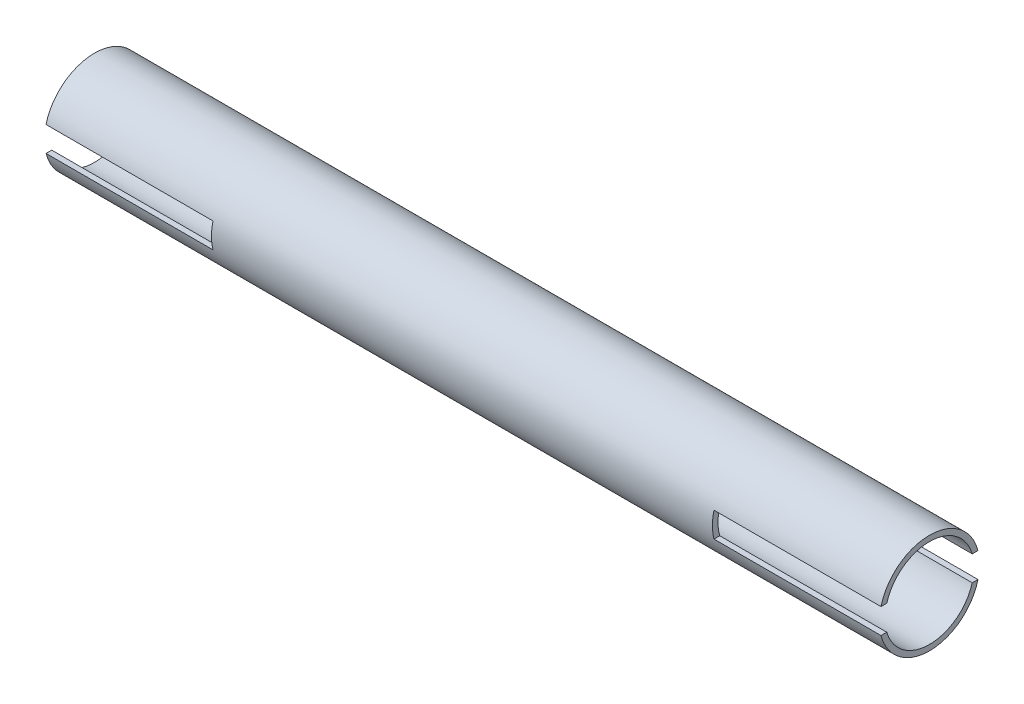
ISO-10303-21;
HEADER;
FILE_DESCRIPTION(('STEP AP214'),'2;1');
FILE_NAME('part.step','',(''),(''),'','','');
FILE_SCHEMA(('AUTOMOTIVE_DESIGN { 1 0 10303 214 1 1 1 1 }'));
ENDSEC;
DATA;
#1=APPLICATION_CONTEXT('core data for automotive mechanical design processes');
#2=APPLICATION_PROTOCOL_DEFINITION('international standard','automotive_design',2000,#1);
#3=PRODUCT_CONTEXT('',#1,'mechanical');
#4=PRODUCT('Part','Part','',(#3));
#5=PRODUCT_RELATED_PRODUCT_CATEGORY('part','',(#4));
#6=PRODUCT_DEFINITION_FORMATION('','',#4);
#7=PRODUCT_DEFINITION_CONTEXT('part definition',#1,'design');
#8=PRODUCT_DEFINITION('design','',#6,#7);
#9=PRODUCT_DEFINITION_SHAPE('','',#8);
#10=(LENGTH_UNIT() NAMED_UNIT(*) SI_UNIT(.MILLI.,.METRE.));
#11=(NAMED_UNIT(*) PLANE_ANGLE_UNIT() SI_UNIT($,.RADIAN.));
#12=(NAMED_UNIT(*) SI_UNIT($,.STERADIAN.) SOLID_ANGLE_UNIT());
#13=UNCERTAINTY_MEASURE_WITH_UNIT(LENGTH_MEASURE(1.E-05),#10,'distance_accuracy_value','');
#14=(GEOMETRIC_REPRESENTATION_CONTEXT(3) GLOBAL_UNCERTAINTY_ASSIGNED_CONTEXT((#13)) GLOBAL_UNIT_ASSIGNED_CONTEXT((#10,
#11,#12)) REPRESENTATION_CONTEXT('',''));
#15=CARTESIAN_POINT('',(0.,0.,0.));
#16=DIRECTION('',(0.,0.,1.));
#17=DIRECTION('',(1.,0.,0.));
#18=AXIS2_PLACEMENT_3D('',#15,#16,#17);
#19=CARTESIAN_POINT('',(158.75,4.7625,165.2397));
#20=DIRECTION('',(0.,1.,0.));
#21=DIRECTION('',(0.,0.,1.));
#22=AXIS2_PLACEMENT_3D('',#19,#20,#21);
#23=PLANE('',#22);
#24=DIRECTION('',(0.,0.,1.));
#25=VECTOR('',#24,1.);
#26=CARTESIAN_POINT('',(95.25,4.7625,165.2397));
#27=LINE('',#26,#25);
#28=CARTESIAN_POINT('',(95.25,4.76249999999989,-16.2586340444086));
#29=VERTEX_POINT('',#28);
#30=CARTESIAN_POINT('',(95.25,4.76249999999997,-18.4450831863128));
#31=VERTEX_POINT('',#30);
#32=EDGE_CURVE('E135',#29,#31,#27,.F.);
#33=ORIENTED_EDGE('',*,*,#32,.T.);
#34=DIRECTION('',(1.,0.,0.));
#35=VECTOR('',#34,1.);
#36=CARTESIAN_POINT('',(-158.75,4.76249999999994,-18.4450831863128));
#37=LINE('',#36,#35);
#38=CARTESIAN_POINT('',(158.75,4.76249999999997,-18.4450831863128));
#39=VERTEX_POINT('',#38);
#40=EDGE_CURVE('E194',#39,#31,#37,.F.);
#41=ORIENTED_EDGE('',*,*,#40,.F.);
#42=DIRECTION('',(0.,0.,-1.));
#43=VECTOR('',#42,1.);
#44=CARTESIAN_POINT('',(158.75,4.7625,0.));
#45=LINE('',#44,#43);
#46=CARTESIAN_POINT('',(158.75,4.76249999999989,-16.2586340444086));
#47=VERTEX_POINT('',#46);
#48=EDGE_CURVE('E198',#47,#39,#45,.T.);
#49=ORIENTED_EDGE('',*,*,#48,.F.);
#50=DIRECTION('',(1.,0.,0.));
#51=VECTOR('',#50,1.);
#52=CARTESIAN_POINT('',(-158.75,4.76249999999979,-16.2586340444086));
#53=LINE('',#52,#51);
#54=EDGE_CURVE('E125',#47,#29,#53,.F.);
#55=ORIENTED_EDGE('',*,*,#54,.T.);
#56=EDGE_LOOP('',(#33,#41,#49,#55));
#57=FACE_BOUND('',#56,.T.);
#58=ADVANCED_FACE('F17',(#57),#23,.F.);
#59=CARTESIAN_POINT('',(95.25,4.7625,165.2397));
#60=DIRECTION('',(-1.,0.,0.));
#61=DIRECTION('',(0.,0.,1.));
#62=AXIS2_PLACEMENT_3D('',#59,#60,#61);
#63=PLANE('',#62);
#64=CARTESIAN_POINT('',(95.25,0.,0.));
#65=DIRECTION('',(1.,0.,0.));
#66=DIRECTION('',(0.,0.,-1.));
#67=AXIS2_PLACEMENT_3D('',#64,#65,#66);
#68=CIRCLE('',#67,16.9418);
#69=CARTESIAN_POINT('',(95.25,-4.76249999999989,-16.2586340444086));
#70=VERTEX_POINT('',#69);
#71=EDGE_CURVE('E20',#29,#70,#68,.F.);
#72=ORIENTED_EDGE('',*,*,#71,.T.);
#73=DIRECTION('',(0.,0.,-1.));
#74=VECTOR('',#73,1.);
#75=CARTESIAN_POINT('',(95.25,-4.7625,165.2397));
#76=LINE('',#75,#74);
#77=CARTESIAN_POINT('',(95.25,-4.76249999999997,-18.4450831863128));
#78=VERTEX_POINT('',#77);
#79=EDGE_CURVE('E133',#70,#78,#76,.T.);
#80=ORIENTED_EDGE('',*,*,#79,.T.);
#81=CARTESIAN_POINT('',(95.25,0.,0.));
#82=DIRECTION('',(1.,0.,0.));
#83=DIRECTION('',(0.,0.,-1.));
#84=AXIS2_PLACEMENT_3D('',#81,#82,#83);
#85=CIRCLE('',#84,19.05);
#86=EDGE_CURVE('E192',#31,#78,#85,.F.);
#87=ORIENTED_EDGE('',*,*,#86,.F.);
#88=ORIENTED_EDGE('',*,*,#32,.F.);
#89=EDGE_LOOP('',(#72,#80,#87,#88));
#90=FACE_BOUND('',#89,.T.);
#91=ADVANCED_FACE('F131',(#90),#63,.F.);
#92=CARTESIAN_POINT('',(95.25,-4.7625,165.2397));
#93=DIRECTION('',(0.,-1.,0.));
#94=DIRECTION('',(0.,0.,-1.));
#95=AXIS2_PLACEMENT_3D('',#92,#93,#94);
#96=PLANE('',#95);
#97=ORIENTED_EDGE('',*,*,#79,.F.);
#98=DIRECTION('',(1.,0.,0.));
#99=VECTOR('',#98,1.);
#100=CARTESIAN_POINT('',(-158.75,-4.76249999999979,-16.2586340444086));
#101=LINE('',#100,#99);
#102=CARTESIAN_POINT('',(158.75,-4.76249999999989,-16.2586340444086));
#103=VERTEX_POINT('',#102);
#104=EDGE_CURVE('E138',#70,#103,#101,.T.);
#105=ORIENTED_EDGE('',*,*,#104,.T.);
#106=DIRECTION('',(0.,0.,-1.));
#107=VECTOR('',#106,1.);
#108=CARTESIAN_POINT('',(158.75,-4.7625,0.));
#109=LINE('',#108,#107);
#110=CARTESIAN_POINT('',(158.75,-4.76249999999997,-18.4450831863128));
#111=VERTEX_POINT('',#110);
#112=EDGE_CURVE('E205',#111,#103,#109,.F.);
#113=ORIENTED_EDGE('',*,*,#112,.F.);
#114=DIRECTION('',(1.,0.,0.));
#115=VECTOR('',#114,1.);
#116=CARTESIAN_POINT('',(-158.75,-4.76249999999994,-18.4450831863128));
#117=LINE('',#116,#115);
#118=EDGE_CURVE('E145',#78,#111,#117,.T.);
#119=ORIENTED_EDGE('',*,*,#118,.F.);
#120=EDGE_LOOP('',(#97,#105,#113,#119));
#121=FACE_BOUND('',#120,.T.);
#122=ADVANCED_FACE('F141',(#121),#96,.F.);
#123=CARTESIAN_POINT('',(-95.25,-4.7625,165.2397));
#124=DIRECTION('',(0.,1.,0.));
#125=DIRECTION('',(0.,0.,1.));
#126=AXIS2_PLACEMENT_3D('',#123,#124,#125);
#127=PLANE('',#126);
#128=DIRECTION('',(1.,0.,0.));
#129=VECTOR('',#128,1.);
#130=CARTESIAN_POINT('',(-158.75,-4.76249999999979,-16.2586340444086));
#131=LINE('',#130,#129);
#132=CARTESIAN_POINT('',(-158.75,-4.76249999999989,-16.2586340444086));
#133=VERTEX_POINT('',#132);
#134=CARTESIAN_POINT('',(-95.25,-4.76249999999989,-16.2586340444086));
#135=VERTEX_POINT('',#134);
#136=EDGE_CURVE('E153',#133,#135,#131,.T.);
#137=ORIENTED_EDGE('',*,*,#136,.T.);
#138=DIRECTION('',(0.,0.,1.));
#139=VECTOR('',#138,1.);
#140=CARTESIAN_POINT('',(-95.25,-4.7625,165.2397));
#141=LINE('',#140,#139);
#142=CARTESIAN_POINT('',(-95.25,-4.76249999999997,-18.4450831863128));
#143=VERTEX_POINT('',#142);
#144=EDGE_CURVE('E147',#143,#135,#141,.T.);
#145=ORIENTED_EDGE('',*,*,#144,.F.);
#146=DIRECTION('',(1.,0.,0.));
#147=VECTOR('',#146,1.);
#148=CARTESIAN_POINT('',(-158.75,-4.76249999999994,-18.4450831863128));
#149=LINE('',#148,#147);
#150=CARTESIAN_POINT('',(-158.75,-4.76249999999997,-18.4450831863128));
#151=VERTEX_POINT('',#150);
#152=EDGE_CURVE('E191',#151,#143,#149,.T.);
#153=ORIENTED_EDGE('',*,*,#152,.F.);
#154=DIRECTION('',(0.,0.,-1.));
#155=VECTOR('',#154,1.);
#156=CARTESIAN_POINT('',(-158.75,-4.7625,0.));
#157=LINE('',#156,#155);
#158=EDGE_CURVE('E209',#151,#133,#157,.F.);
#159=ORIENTED_EDGE('',*,*,#158,.T.);
#160=EDGE_LOOP('',(#137,#145,#153,#159));
#161=FACE_BOUND('',#160,.T.);
#162=ADVANCED_FACE('F410',(#161),#127,.T.);
#163=CARTESIAN_POINT('',(-95.25,4.7625,165.2397));
#164=DIRECTION('',(-1.,0.,0.));
#165=DIRECTION('',(0.,0.,1.));
#166=AXIS2_PLACEMENT_3D('',#163,#164,#165);
#167=PLANE('',#166);
#168=CARTESIAN_POINT('',(-95.25,0.,0.));
#169=DIRECTION('',(1.,0.,0.));
#170=DIRECTION('',(0.,0.,-1.));
#171=AXIS2_PLACEMENT_3D('',#168,#169,#170);
#172=CIRCLE('',#171,16.9418);
#173=CARTESIAN_POINT('',(-95.25,4.7625,-16.2586340444089));
#174=VERTEX_POINT('',#173);
#175=EDGE_CURVE('E155',#135,#174,#172,.T.);
#176=ORIENTED_EDGE('',*,*,#175,.T.);
#177=DIRECTION('',(0.,0.,-1.));
#178=VECTOR('',#177,1.);
#179=CARTESIAN_POINT('',(-95.25,4.7625,165.2397));
#180=LINE('',#179,#178);
#181=CARTESIAN_POINT('',(-95.25,4.76249999999997,-18.4450831863128));
#182=VERTEX_POINT('',#181);
#183=EDGE_CURVE('E211',#182,#174,#180,.F.);
#184=ORIENTED_EDGE('',*,*,#183,.F.);
#185=CARTESIAN_POINT('',(-95.25,0.,0.));
#186=DIRECTION('',(1.,0.,0.));
#187=DIRECTION('',(0.,0.,-1.));
#188=AXIS2_PLACEMENT_3D('',#185,#186,#187);
#189=CIRCLE('',#188,19.05);
#190=EDGE_CURVE('E188',#143,#182,#189,.T.);
#191=ORIENTED_EDGE('',*,*,#190,.F.);
#192=ORIENTED_EDGE('',*,*,#144,.T.);
#193=EDGE_LOOP('',(#176,#184,#191,#192));
#194=FACE_BOUND('',#193,.T.);
#195=ADVANCED_FACE('F402',(#194),#167,.T.);
#196=CARTESIAN_POINT('',(-158.75,4.7625,165.2397));
#197=DIRECTION('',(0.,-1.,0.));
#198=DIRECTION('',(0.,0.,-1.));
#199=AXIS2_PLACEMENT_3D('',#196,#197,#198);
#200=PLANE('',#199);
#201=DIRECTION('',(1.,0.,0.));
#202=VECTOR('',#201,1.);
#203=CARTESIAN_POINT('',(-158.75,4.76249999999994,-18.4450831863128));
#204=LINE('',#203,#202);
#205=CARTESIAN_POINT('',(-158.75,4.76249999999997,-18.4450831863128));
#206=VERTEX_POINT('',#205);
#207=EDGE_CURVE('E187',#182,#206,#204,.F.);
#208=ORIENTED_EDGE('',*,*,#207,.F.);
#209=ORIENTED_EDGE('',*,*,#183,.T.);
#210=DIRECTION('',(1.,0.,0.));
#211=VECTOR('',#210,1.);
#212=CARTESIAN_POINT('',(-158.75,4.7625,-16.2586340444093));
#213=LINE('',#212,#211);
#214=CARTESIAN_POINT('',(-158.75,4.7625,-16.2586340444089));
#215=VERTEX_POINT('',#214);
#216=EDGE_CURVE('E212',#174,#215,#213,.F.);
#217=ORIENTED_EDGE('',*,*,#216,.T.);
#218=DIRECTION('',(0.,0.,-1.));
#219=VECTOR('',#218,1.);
#220=CARTESIAN_POINT('',(-158.75,4.7625,0.));
#221=LINE('',#220,#219);
#222=EDGE_CURVE('E186',#215,#206,#221,.T.);
#223=ORIENTED_EDGE('',*,*,#222,.T.);
#224=EDGE_LOOP('',(#208,#209,#217,#223));
#225=FACE_BOUND('',#224,.T.);
#226=ADVANCED_FACE('F394',(#225),#200,.T.);
#227=CARTESIAN_POINT('',(-158.75,0.,0.));
#228=DIRECTION('',(1.,0.,0.));
#229=DIRECTION('',(0.,0.,-1.));
#230=AXIS2_PLACEMENT_3D('',#227,#228,#229);
#231=CYLINDRICAL_SURFACE('',#230,16.9418);
#232=CARTESIAN_POINT('',(158.75,0.,0.));
#233=DIRECTION('',(1.,0.,0.));
#234=DIRECTION('',(0.,0.,-1.));
#235=AXIS2_PLACEMENT_3D('',#232,#233,#234);
#236=CIRCLE('',#235,16.9418);
#237=CARTESIAN_POINT('',(158.75,-4.7625,16.2586340444089));
#238=VERTEX_POINT('',#237);
#239=EDGE_CURVE('E152',#103,#238,#236,.F.);
#240=ORIENTED_EDGE('',*,*,#239,.F.);
#241=ORIENTED_EDGE('',*,*,#104,.F.);
#242=ORIENTED_EDGE('',*,*,#71,.F.);
#243=ORIENTED_EDGE('',*,*,#54,.F.);
#244=CARTESIAN_POINT('',(158.75,0.,0.));
#245=DIRECTION('',(1.,0.,0.));
#246=DIRECTION('',(0.,0.,-1.));
#247=AXIS2_PLACEMENT_3D('',#244,#245,#246);
#248=CIRCLE('',#247,16.9418);
#249=CARTESIAN_POINT('',(158.75,4.7625,16.2586340444089));
#250=VERTEX_POINT('',#249);
#251=EDGE_CURVE('E195',#250,#47,#248,.F.);
#252=ORIENTED_EDGE('',*,*,#251,.F.);
#253=DIRECTION('',(1.,0.,0.));
#254=VECTOR('',#253,1.);
#255=CARTESIAN_POINT('',(158.75,4.7625,16.2586340444093));
#256=LINE('',#255,#254);
#257=CARTESIAN_POINT('',(95.25,4.7625,16.2586340444089));
#258=VERTEX_POINT('',#257);
#259=EDGE_CURVE('E235',#250,#258,#256,.F.);
#260=ORIENTED_EDGE('',*,*,#259,.T.);
#261=CARTESIAN_POINT('',(95.25,0.,0.));
#262=DIRECTION('',(1.,0.,0.));
#263=DIRECTION('',(0.,0.,-1.));
#264=AXIS2_PLACEMENT_3D('',#261,#262,#263);
#265=CIRCLE('',#264,16.9418);
#266=CARTESIAN_POINT('',(95.25,-4.7625,16.2586340444089));
#267=VERTEX_POINT('',#266);
#268=EDGE_CURVE('E200',#258,#267,#265,.T.);
#269=ORIENTED_EDGE('',*,*,#268,.T.);
#270=DIRECTION('',(1.,0.,0.));
#271=VECTOR('',#270,1.);
#272=CARTESIAN_POINT('',(95.25,-4.7625,16.2586340444093));
#273=LINE('',#272,#271);
#274=EDGE_CURVE('E158',#267,#238,#273,.T.);
#275=ORIENTED_EDGE('',*,*,#274,.T.);
#276=EDGE_LOOP('',(#240,#241,#242,#243,#252,#260,#269,#275));
#277=FACE_BOUND('',#276,.T.);
#278=DIRECTION('',(1.,0.,0.));
#279=VECTOR('',#278,1.);
#280=CARTESIAN_POINT('',(-158.75,4.7625,16.2586340444093));
#281=LINE('',#280,#279);
#282=CARTESIAN_POINT('',(-158.75,4.7625,16.2586340444089));
#283=VERTEX_POINT('',#282);
#284=CARTESIAN_POINT('',(-95.25,4.7625,16.2586340444089));
#285=VERTEX_POINT('',#284);
#286=EDGE_CURVE('E260',#283,#285,#281,.T.);
#287=ORIENTED_EDGE('',*,*,#286,.F.);
#288=CARTESIAN_POINT('',(-158.75,0.,0.));
#289=DIRECTION('',(1.,0.,0.));
#290=DIRECTION('',(0.,0.,-1.));
#291=AXIS2_PLACEMENT_3D('',#288,#289,#290);
#292=CIRCLE('',#291,16.9418);
#293=EDGE_CURVE('E184',#283,#215,#292,.F.);
#294=ORIENTED_EDGE('',*,*,#293,.T.);
#295=ORIENTED_EDGE('',*,*,#216,.F.);
#296=ORIENTED_EDGE('',*,*,#175,.F.);
#297=ORIENTED_EDGE('',*,*,#136,.F.);
#298=CARTESIAN_POINT('',(-158.75,0.,0.));
#299=DIRECTION('',(1.,0.,0.));
#300=DIRECTION('',(0.,0.,-1.));
#301=AXIS2_PLACEMENT_3D('',#298,#299,#300);
#302=CIRCLE('',#301,16.9418);
#303=CARTESIAN_POINT('',(-158.75,-4.7625,16.2586340444089));
#304=VERTEX_POINT('',#303);
#305=EDGE_CURVE('E206',#133,#304,#302,.F.);
#306=ORIENTED_EDGE('',*,*,#305,.T.);
#307=DIRECTION('',(1.,0.,0.));
#308=VECTOR('',#307,1.);
#309=CARTESIAN_POINT('',(-95.25,-4.7625,16.2586340444093));
#310=LINE('',#309,#308);
#311=CARTESIAN_POINT('',(-95.25,-4.7625,16.2586340444089));
#312=VERTEX_POINT('',#311);
#313=EDGE_CURVE('E161',#312,#304,#310,.F.);
#314=ORIENTED_EDGE('',*,*,#313,.F.);
#315=CARTESIAN_POINT('',(-95.25,0.,0.));
#316=DIRECTION('',(1.,0.,0.));
#317=DIRECTION('',(0.,0.,-1.));
#318=AXIS2_PLACEMENT_3D('',#315,#316,#317);
#319=CIRCLE('',#318,16.9418);
#320=EDGE_CURVE('E164',#285,#312,#319,.T.);
#321=ORIENTED_EDGE('',*,*,#320,.F.);
#322=EDGE_LOOP('',(#287,#294,#295,#296,#297,#306,#314,#321));
#323=FACE_BOUND('',#322,.T.);
#324=ADVANCED_FACE('F149',(#277,#323),#231,.F.);
#325=CARTESIAN_POINT('',(-95.25,4.7625,165.2397));
#326=DIRECTION('',(-1.,0.,0.));
#327=DIRECTION('',(0.,0.,1.));
#328=AXIS2_PLACEMENT_3D('',#325,#326,#327);
#329=PLANE('',#328);
#330=CARTESIAN_POINT('',(-95.25,0.,0.));
#331=DIRECTION('',(1.,0.,0.));
#332=DIRECTION('',(0.,0.,-1.));
#333=AXIS2_PLACEMENT_3D('',#330,#331,#332);
#334=CIRCLE('',#333,19.05);
#335=CARTESIAN_POINT('',(-95.25,4.76249999999997,18.4450831863128));
#336=VERTEX_POINT('',#335);
#337=CARTESIAN_POINT('',(-95.25,-4.76249999999997,18.4450831863128));
#338=VERTEX_POINT('',#337);
#339=EDGE_CURVE('E180',#336,#338,#334,.T.);
#340=ORIENTED_EDGE('',*,*,#339,.F.);
#341=DIRECTION('',(0.,0.,-1.));
#342=VECTOR('',#341,1.);
#343=CARTESIAN_POINT('',(-95.25,4.7625,165.2397));
#344=LINE('',#343,#342);
#345=EDGE_CURVE('E183',#285,#336,#344,.F.);
#346=ORIENTED_EDGE('',*,*,#345,.F.);
#347=ORIENTED_EDGE('',*,*,#320,.T.);
#348=DIRECTION('',(0.,0.,1.));
#349=VECTOR('',#348,1.);
#350=CARTESIAN_POINT('',(-95.25,-4.7625,165.2397));
#351=LINE('',#350,#349);
#352=EDGE_CURVE('E163',#338,#312,#351,.F.);
#353=ORIENTED_EDGE('',*,*,#352,.F.);
#354=EDGE_LOOP('',(#340,#346,#347,#353));
#355=FACE_BOUND('',#354,.T.);
#356=ADVANCED_FACE('F377',(#355),#329,.T.);
#357=CARTESIAN_POINT('',(-95.25,-4.7625,165.2397));
#358=DIRECTION('',(0.,1.,0.));
#359=DIRECTION('',(0.,0.,1.));
#360=AXIS2_PLACEMENT_3D('',#357,#358,#359);
#361=PLANE('',#360);
#362=DIRECTION('',(1.,0.,0.));
#363=VECTOR('',#362,1.);
#364=CARTESIAN_POINT('',(-158.75,-4.76249999999993,18.4450831863128));
#365=LINE('',#364,#363);
#366=CARTESIAN_POINT('',(-158.75,-4.76249999999997,18.4450831863128));
#367=VERTEX_POINT('',#366);
#368=EDGE_CURVE('E179',#338,#367,#365,.F.);
#369=ORIENTED_EDGE('',*,*,#368,.F.);
#370=ORIENTED_EDGE('',*,*,#352,.T.);
#371=ORIENTED_EDGE('',*,*,#313,.T.);
#372=DIRECTION('',(0.,0.,-1.));
#373=VECTOR('',#372,1.);
#374=CARTESIAN_POINT('',(-158.75,-4.7625,0.));
#375=LINE('',#374,#373);
#376=EDGE_CURVE('E253',#304,#367,#375,.F.);
#377=ORIENTED_EDGE('',*,*,#376,.T.);
#378=EDGE_LOOP('',(#369,#370,#371,#377));
#379=FACE_BOUND('',#378,.T.);
#380=ADVANCED_FACE('F368',(#379),#361,.T.);
#381=CARTESIAN_POINT('',(-158.75,0.,0.));
#382=DIRECTION('',(1.,0.,0.));
#383=DIRECTION('',(0.,0.,-1.));
#384=AXIS2_PLACEMENT_3D('',#381,#382,#383);
#385=PLANE('',#384);
#386=ORIENTED_EDGE('',*,*,#305,.F.);
#387=ORIENTED_EDGE('',*,*,#158,.F.);
#388=CARTESIAN_POINT('',(-158.75,0.,0.));
#389=DIRECTION('',(1.,0.,0.));
#390=DIRECTION('',(0.,0.,-1.));
#391=AXIS2_PLACEMENT_3D('',#388,#389,#390);
#392=CIRCLE('',#391,19.05);
#393=EDGE_CURVE('E177',#367,#151,#392,.T.);
#394=ORIENTED_EDGE('',*,*,#393,.F.);
#395=ORIENTED_EDGE('',*,*,#376,.F.);
#396=EDGE_LOOP('',(#386,#387,#394,#395));
#397=FACE_BOUND('',#396,.T.);
#398=ADVANCED_FACE('F296',(#397),#385,.F.);
#399=CARTESIAN_POINT('',(158.75,0.,0.));
#400=DIRECTION('',(1.,0.,0.));
#401=DIRECTION('',(0.,0.,-1.));
#402=AXIS2_PLACEMENT_3D('',#399,#400,#401);
#403=PLANE('',#402);
#404=ORIENTED_EDGE('',*,*,#239,.T.);
#405=DIRECTION('',(0.,0.,-1.));
#406=VECTOR('',#405,1.);
#407=CARTESIAN_POINT('',(158.75,-4.7625,165.2397));
#408=LINE('',#407,#406);
#409=CARTESIAN_POINT('',(158.75,-4.76249999999997,18.4450831863128));
#410=VERTEX_POINT('',#409);
#411=EDGE_CURVE('E204',#238,#410,#408,.F.);
#412=ORIENTED_EDGE('',*,*,#411,.T.);
#413=CARTESIAN_POINT('',(158.75,0.,0.));
#414=DIRECTION('',(1.,0.,0.));
#415=DIRECTION('',(0.,0.,-1.));
#416=AXIS2_PLACEMENT_3D('',#413,#414,#415);
#417=CIRCLE('',#416,19.05);
#418=EDGE_CURVE('E174',#111,#410,#417,.F.);
#419=ORIENTED_EDGE('',*,*,#418,.F.);
#420=ORIENTED_EDGE('',*,*,#112,.T.);
#421=EDGE_LOOP('',(#404,#412,#419,#420));
#422=FACE_BOUND('',#421,.T.);
#423=ADVANCED_FACE('F283',(#422),#403,.T.);
#424=CARTESIAN_POINT('',(95.25,-4.7625,165.2397));
#425=DIRECTION('',(0.,-1.,0.));
#426=DIRECTION('',(0.,0.,-1.));
#427=AXIS2_PLACEMENT_3D('',#424,#425,#426);
#428=PLANE('',#427);
#429=DIRECTION('',(0.,0.,1.));
#430=VECTOR('',#429,1.);
#431=CARTESIAN_POINT('',(95.25,-4.7625,165.2397));
#432=LINE('',#431,#430);
#433=CARTESIAN_POINT('',(95.25,-4.76249999999997,18.4450831863128));
#434=VERTEX_POINT('',#433);
#435=EDGE_CURVE('E202',#267,#434,#432,.T.);
#436=ORIENTED_EDGE('',*,*,#435,.T.);
#437=DIRECTION('',(1.,0.,0.));
#438=VECTOR('',#437,1.);
#439=CARTESIAN_POINT('',(-158.75,-4.76249999999993,18.4450831863128));
#440=LINE('',#439,#438);
#441=EDGE_CURVE('E173',#410,#434,#440,.F.);
#442=ORIENTED_EDGE('',*,*,#441,.F.);
#443=ORIENTED_EDGE('',*,*,#411,.F.);
#444=ORIENTED_EDGE('',*,*,#274,.F.);
#445=EDGE_LOOP('',(#436,#442,#443,#444));
#446=FACE_BOUND('',#445,.T.);
#447=ADVANCED_FACE('F285',(#446),#428,.F.);
#448=CARTESIAN_POINT('',(95.25,4.7625,165.2397));
#449=DIRECTION('',(-1.,0.,0.));
#450=DIRECTION('',(0.,0.,1.));
#451=AXIS2_PLACEMENT_3D('',#448,#449,#450);
#452=PLANE('',#451);
#453=ORIENTED_EDGE('',*,*,#268,.F.);
#454=DIRECTION('',(0.,0.,1.));
#455=VECTOR('',#454,1.);
#456=CARTESIAN_POINT('',(95.25,4.7625,165.2397));
#457=LINE('',#456,#455);
#458=CARTESIAN_POINT('',(95.25,4.76249999999997,18.4450831863128));
#459=VERTEX_POINT('',#458);
#460=EDGE_CURVE('E199',#258,#459,#457,.T.);
#461=ORIENTED_EDGE('',*,*,#460,.T.);
#462=CARTESIAN_POINT('',(95.25,0.,0.));
#463=DIRECTION('',(1.,0.,0.));
#464=DIRECTION('',(0.,0.,-1.));
#465=AXIS2_PLACEMENT_3D('',#462,#463,#464);
#466=CIRCLE('',#465,19.05);
#467=EDGE_CURVE('E170',#434,#459,#466,.F.);
#468=ORIENTED_EDGE('',*,*,#467,.F.);
#469=ORIENTED_EDGE('',*,*,#435,.F.);
#470=EDGE_LOOP('',(#453,#461,#468,#469));
#471=FACE_BOUND('',#470,.T.);
#472=ADVANCED_FACE('F287',(#471),#452,.F.);
#473=CARTESIAN_POINT('',(158.75,4.7625,165.2397));
#474=DIRECTION('',(0.,1.,0.));
#475=DIRECTION('',(0.,0.,1.));
#476=AXIS2_PLACEMENT_3D('',#473,#474,#475);
#477=PLANE('',#476);
#478=ORIENTED_EDGE('',*,*,#460,.F.);
#479=ORIENTED_EDGE('',*,*,#259,.F.);
#480=DIRECTION('',(0.,0.,-1.));
#481=VECTOR('',#480,1.);
#482=CARTESIAN_POINT('',(158.75,4.7625,0.));
#483=LINE('',#482,#481);
#484=CARTESIAN_POINT('',(158.75,4.76249999999997,18.4450831863128));
#485=VERTEX_POINT('',#484);
#486=EDGE_CURVE('E234',#485,#250,#483,.T.);
#487=ORIENTED_EDGE('',*,*,#486,.F.);
#488=DIRECTION('',(1.,0.,0.));
#489=VECTOR('',#488,1.);
#490=CARTESIAN_POINT('',(-158.75,4.76249999999994,18.4450831863128));
#491=LINE('',#490,#489);
#492=EDGE_CURVE('E169',#459,#485,#491,.T.);
#493=ORIENTED_EDGE('',*,*,#492,.F.);
#494=EDGE_LOOP('',(#478,#479,#487,#493));
#495=FACE_BOUND('',#494,.T.);
#496=ADVANCED_FACE('F278',(#495),#477,.F.);
#497=CARTESIAN_POINT('',(158.75,0.,0.));
#498=DIRECTION('',(1.,0.,0.));
#499=DIRECTION('',(0.,0.,-1.));
#500=AXIS2_PLACEMENT_3D('',#497,#498,#499);
#501=PLANE('',#500);
#502=CARTESIAN_POINT('',(158.75,0.,0.));
#503=DIRECTION('',(1.,0.,0.));
#504=DIRECTION('',(0.,0.,-1.));
#505=AXIS2_PLACEMENT_3D('',#502,#503,#504);
#506=CIRCLE('',#505,19.05);
#507=EDGE_CURVE('E167',#485,#39,#506,.F.);
#508=ORIENTED_EDGE('',*,*,#507,.F.);
#509=ORIENTED_EDGE('',*,*,#486,.T.);
#510=ORIENTED_EDGE('',*,*,#251,.T.);
#511=ORIENTED_EDGE('',*,*,#48,.T.);
#512=EDGE_LOOP('',(#508,#509,#510,#511));
#513=FACE_BOUND('',#512,.T.);
#514=ADVANCED_FACE('F280',(#513),#501,.T.);
#515=CARTESIAN_POINT('',(-158.75,0.,0.));
#516=DIRECTION('',(1.,0.,0.));
#517=DIRECTION('',(0.,0.,-1.));
#518=AXIS2_PLACEMENT_3D('',#515,#516,#517);
#519=PLANE('',#518);
#520=CARTESIAN_POINT('',(-158.75,0.,0.));
#521=DIRECTION('',(1.,0.,0.));
#522=DIRECTION('',(0.,0.,-1.));
#523=AXIS2_PLACEMENT_3D('',#520,#521,#522);
#524=CIRCLE('',#523,19.05);
#525=CARTESIAN_POINT('',(-158.75,4.76249999999997,18.4450831863128));
#526=VERTEX_POINT('',#525);
#527=EDGE_CURVE('E26',#206,#526,#524,.T.);
#528=ORIENTED_EDGE('',*,*,#527,.F.);
#529=ORIENTED_EDGE('',*,*,#222,.F.);
#530=ORIENTED_EDGE('',*,*,#293,.F.);
#531=DIRECTION('',(0.,0.,-1.));
#532=VECTOR('',#531,1.);
#533=CARTESIAN_POINT('',(-158.75,4.7625,165.2397));
#534=LINE('',#533,#532);
#535=EDGE_CURVE('E35',#526,#283,#534,.T.);
#536=ORIENTED_EDGE('',*,*,#535,.F.);
#537=EDGE_LOOP('',(#528,#529,#530,#536));
#538=FACE_BOUND('',#537,.T.);
#539=ADVANCED_FACE('F304',(#538),#519,.F.);
#540=CARTESIAN_POINT('',(-158.75,4.7625,165.2397));
#541=DIRECTION('',(0.,-1.,0.));
#542=DIRECTION('',(0.,0.,-1.));
#543=AXIS2_PLACEMENT_3D('',#540,#541,#542);
#544=PLANE('',#543);
#545=ORIENTED_EDGE('',*,*,#286,.T.);
#546=ORIENTED_EDGE('',*,*,#345,.T.);
#547=DIRECTION('',(1.,0.,0.));
#548=VECTOR('',#547,1.);
#549=CARTESIAN_POINT('',(-158.75,4.76249999999994,18.4450831863128));
#550=LINE('',#549,#548);
#551=EDGE_CURVE('E11',#526,#336,#550,.T.);
#552=ORIENTED_EDGE('',*,*,#551,.F.);
#553=ORIENTED_EDGE('',*,*,#535,.T.);
#554=EDGE_LOOP('',(#545,#546,#552,#553));
#555=FACE_BOUND('',#554,.T.);
#556=ADVANCED_FACE('F299',(#555),#544,.T.);
#557=CARTESIAN_POINT('',(-158.75,0.,0.));
#558=DIRECTION('',(1.,0.,0.));
#559=DIRECTION('',(0.,0.,-1.));
#560=AXIS2_PLACEMENT_3D('',#557,#558,#559);
#561=CYLINDRICAL_SURFACE('',#560,19.05);
#562=ORIENTED_EDGE('',*,*,#118,.T.);
#563=ORIENTED_EDGE('',*,*,#418,.T.);
#564=ORIENTED_EDGE('',*,*,#441,.T.);
#565=ORIENTED_EDGE('',*,*,#467,.T.);
#566=ORIENTED_EDGE('',*,*,#492,.T.);
#567=ORIENTED_EDGE('',*,*,#507,.T.);
#568=ORIENTED_EDGE('',*,*,#40,.T.);
#569=ORIENTED_EDGE('',*,*,#86,.T.);
#570=EDGE_LOOP('',(#562,#563,#564,#565,#566,#567,#568,#569));
#571=FACE_BOUND('',#570,.T.);
#572=ORIENTED_EDGE('',*,*,#527,.T.);
#573=ORIENTED_EDGE('',*,*,#551,.T.);
#574=ORIENTED_EDGE('',*,*,#339,.T.);
#575=ORIENTED_EDGE('',*,*,#368,.T.);
#576=ORIENTED_EDGE('',*,*,#393,.T.);
#577=ORIENTED_EDGE('',*,*,#152,.T.);
#578=ORIENTED_EDGE('',*,*,#190,.T.);
#579=ORIENTED_EDGE('',*,*,#207,.T.);
#580=EDGE_LOOP('',(#572,#573,#574,#575,#576,#577,#578,#579));
#581=FACE_BOUND('',#580,.T.);
#582=ADVANCED_FACE('F273',(#571,#581),#561,.T.);
#583=CLOSED_SHELL('',(#58,#91,#122,#162,#195,#226,#324,#356,#380,#398,#423,#447,#472,#496,#514,
#539,#556,#582));
#584=MANIFOLD_SOLID_BREP('B1',#583);
#585=ADVANCED_BREP_SHAPE_REPRESENTATION('',(#18,#584),#14);
#586=SHAPE_DEFINITION_REPRESENTATION(#9,#585);
ENDSEC;
END-ISO-10303-21;
